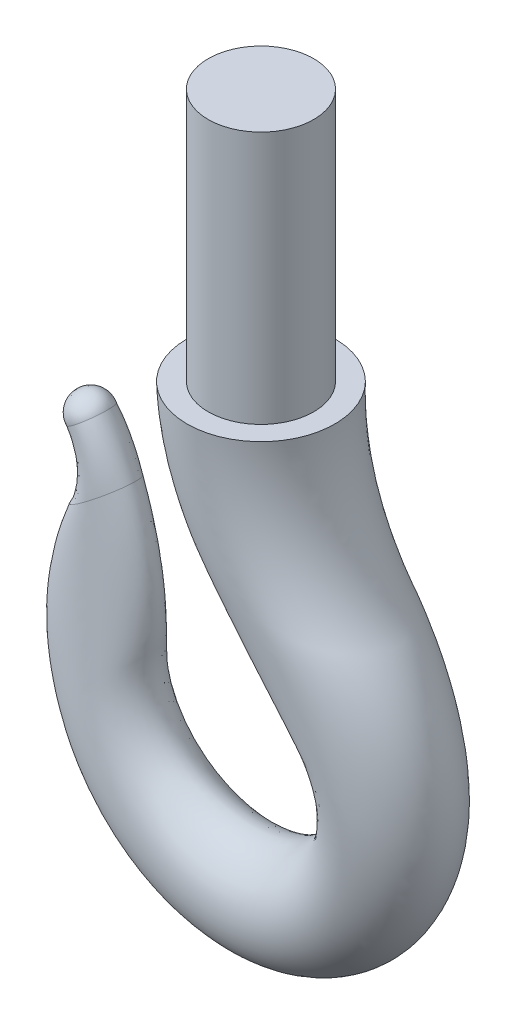
ISO-10303-21;
HEADER;
FILE_DESCRIPTION(('STEP AP214'),'2;1');
FILE_NAME('part.step','',(''),(''),'','','');
FILE_SCHEMA(('AUTOMOTIVE_DESIGN { 1 0 10303 214 1 1 1 1 }'));
ENDSEC;
DATA;
#1=APPLICATION_CONTEXT('core data for automotive mechanical design processes');
#2=APPLICATION_PROTOCOL_DEFINITION('international standard','automotive_design',2000,#1);
#3=PRODUCT_CONTEXT('',#1,'mechanical');
#4=PRODUCT('Part','Part','',(#3));
#5=PRODUCT_RELATED_PRODUCT_CATEGORY('part','',(#4));
#6=PRODUCT_DEFINITION_FORMATION('','',#4);
#7=PRODUCT_DEFINITION_CONTEXT('part definition',#1,'design');
#8=PRODUCT_DEFINITION('design','',#6,#7);
#9=PRODUCT_DEFINITION_SHAPE('','',#8);
#10=(LENGTH_UNIT() NAMED_UNIT(*) SI_UNIT(.MILLI.,.METRE.));
#11=(NAMED_UNIT(*) PLANE_ANGLE_UNIT() SI_UNIT($,.RADIAN.));
#12=(NAMED_UNIT(*) SI_UNIT($,.STERADIAN.) SOLID_ANGLE_UNIT());
#13=UNCERTAINTY_MEASURE_WITH_UNIT(LENGTH_MEASURE(1.E-05),#10,'distance_accuracy_value','');
#14=(GEOMETRIC_REPRESENTATION_CONTEXT(3) GLOBAL_UNCERTAINTY_ASSIGNED_CONTEXT((#13)) GLOBAL_UNIT_ASSIGNED_CONTEXT((#10,
#11,#12)) REPRESENTATION_CONTEXT('',''));
#15=CARTESIAN_POINT('',(0.,0.,0.));
#16=DIRECTION('',(0.,0.,1.));
#17=DIRECTION('',(1.,0.,0.));
#18=AXIS2_PLACEMENT_3D('',#15,#16,#17);
#19=CARTESIAN_POINT('',(0.,0.,0.));
#20=DIRECTION('',(0.,1.,0.));
#21=DIRECTION('',(0.,0.,1.));
#22=AXIS2_PLACEMENT_3D('',#19,#20,#21);
#23=PLANE('',#22);
#24=CARTESIAN_POINT('',(0.,0.,0.));
#25=DIRECTION('',(0.,1.,0.));
#26=DIRECTION('',(0.,0.,1.));
#27=AXIS2_PLACEMENT_3D('',#24,#25,#26);
#28=CIRCLE('',#27,14.);
#29=CARTESIAN_POINT('',(0.,0.,14.));
#30=VERTEX_POINT('',#29);
#31=EDGE_CURVE('E12',#30,#30,#28,.T.);
#32=ORIENTED_EDGE('',*,*,#31,.T.);
#33=EDGE_LOOP('',(#32));
#34=FACE_BOUND('',#33,.T.);
#35=CARTESIAN_POINT('',(0.,0.,0.));
#36=DIRECTION('',(0.,1.,0.));
#37=DIRECTION('',(0.,0.,1.));
#38=AXIS2_PLACEMENT_3D('',#35,#36,#37);
#39=CIRCLE('',#38,10.);
#40=CARTESIAN_POINT('',(0.,0.,10.));
#41=VERTEX_POINT('',#40);
#42=EDGE_CURVE('E162',#41,#41,#39,.T.);
#43=ORIENTED_EDGE('',*,*,#42,.F.);
#44=EDGE_LOOP('',(#43));
#45=FACE_BOUND('',#44,.T.);
#46=ADVANCED_FACE('F88',(#34,#45),#23,.T.);
#47=CARTESIAN_POINT('',(-32.2832191804509,-21.2166316273327,0.));
#48=DIRECTION('',(0.,0.,1.));
#49=DIRECTION('',(1.,0.,0.));
#50=AXIS2_PLACEMENT_3D('',#47,#48,#49);
#51=SPHERICAL_SURFACE('',#50,3.69517158666018);
#52=CARTESIAN_POINT('',(-29.1361884677433,-19.2800132477504,0.));
#53=CARTESIAN_POINT('',(-29.1361884677433,-19.2800132477504,0.482048186348917));
#54=CARTESIAN_POINT('',(-29.2905063515171,-19.3935336801986,1.44598126916191));
#55=CARTESIAN_POINT('',(-29.9503620771288,-19.8789414987417,2.6718688131776));
#56=CARTESIAN_POINT('',(-30.9377884672369,-20.6053192073685,3.49093880466145));
#57=CARTESIAN_POINT('',(-32.1025886580201,-21.4621779079921,3.77858879066938));
#58=CARTESIAN_POINT('',(-33.2673888488033,-22.3190366086154,3.49093880466144));
#59=CARTESIAN_POINT('',(-34.2548152389115,-23.0454143172425,2.67186881317762));
#60=CARTESIAN_POINT('',(-34.9146709645231,-23.5308221357855,1.4459812691619));
#61=CARTESIAN_POINT('',(-35.0689888482969,-23.6443425682336,0.482048186348917));
#62=CARTESIAN_POINT('',(-35.0689888482969,-23.6443425682336,-0.482048186348916));
#63=CARTESIAN_POINT('',(-34.9146709645232,-23.5308221357855,-1.4459812691619));
#64=CARTESIAN_POINT('',(-34.2548152389114,-23.0454143172424,-2.6718688131776));
#65=CARTESIAN_POINT('',(-33.2673888488033,-22.3190366086154,-3.49093880466145));
#66=CARTESIAN_POINT('',(-32.1025886580202,-21.4621779079921,-3.77858879066938));
#67=CARTESIAN_POINT('',(-30.9377884672368,-20.6053192073685,-3.49093880466145));
#68=CARTESIAN_POINT('',(-29.950362077129,-19.8789414987417,-2.6718688131776));
#69=CARTESIAN_POINT('',(-29.290506351517,-19.3935336801985,-1.44598126916191));
#70=CARTESIAN_POINT('',(-29.1361884677433,-19.2800132477504,-0.482048186348917));
#71=CARTESIAN_POINT('',(-29.1361884677433,-19.2800132477504,0.));
#72=B_SPLINE_CURVE_WITH_KNOTS('',3,(#52,#53,#54,#55,#56,#57,#58,#59,#60,#61,#62,#63,#64,#65,#66,
#67,#68,#69,#70,#71),.UNSPECIFIED.,.T.,.F.,(4,1,1,1,1,1,1,1,2,1,1,1,1,1,1,1,4),(0.,0.0625,0.125,
0.1875,0.25,0.3125,0.375,0.4375,0.5,0.5625,0.625,0.6875,0.75,0.8125,0.875,0.9375,1.),.UNSPECIFIED.);
#73=CARTESIAN_POINT('',(-29.1361884677433,-19.2800132477504,0.));
#74=VERTEX_POINT('',#73);
#75=EDGE_CURVE('E104',#74,#74,#72,.T.);
#76=ORIENTED_EDGE('',*,*,#75,.F.);
#77=EDGE_LOOP('',(#76));
#78=FACE_BOUND('',#77,.T.);
#79=ADVANCED_FACE('F90',(#78),#51,.T.);
#80=CARTESIAN_POINT('',(-23.831890082785,-28.35520758759,0.));
#81=CARTESIAN_POINT('',(-25.2662189984446,-25.1740776091497,0.));
#82=CARTESIAN_POINT('',(-27.0393677070277,-22.1303982882976,0.));
#83=CARTESIAN_POINT('',(-29.1361884677433,-19.2800132477504,0.));
#84=CARTESIAN_POINT('',(-23.831890082785,-28.35520758759,-0.568207212607572));
#85=CARTESIAN_POINT('',(-25.2662189984446,-25.1740776091497,-0.53948753718802));
#86=CARTESIAN_POINT('',(-27.0393677070277,-22.1303982882976,-0.510767861768469));
#87=CARTESIAN_POINT('',(-29.1361884677433,-19.2800132477504,-0.482048186348917));
#88=CARTESIAN_POINT('',(-24.1570306193986,-28.5851522240037,-1.70442646142253));
#89=CARTESIAN_POINT('',(-25.4597638242147,-25.3823461165194,-1.61827806400232));
#90=CARTESIAN_POINT('',(-27.1762420815947,-22.27325670226,-1.53212966658212));
#91=CARTESIAN_POINT('',(-29.290506351517,-19.3935336801985,-1.44598126916191));
#92=CARTESIAN_POINT('',(-25.4278526780244,-29.5033418131165,-3.14942800427261));
#93=CARTESIAN_POINT('',(-26.2469748388891,-26.2205198864843,-2.99024160724094));
#94=CARTESIAN_POINT('',(-27.7608117759701,-22.8674122867143,-2.83105521020927));
#95=CARTESIAN_POINT('',(-29.950362077129,-19.8789414987417,-2.6718688131776));
#96=CARTESIAN_POINT('',(-27.2474159919995,-30.8326279337398,-4.11489279949806));
#97=CARTESIAN_POINT('',(-27.3972213387829,-27.4387792159009,-3.90690813455252));
#98=CARTESIAN_POINT('',(-28.6350990748959,-23.7450415120166,-3.69892346960699));
#99=CARTESIAN_POINT('',(-30.9377884672368,-20.6053192073685,-3.49093880466145));
#100=CARTESIAN_POINT('',(-29.3499826293955,-32.3768206629841,-4.4539561288373));
#101=CARTESIAN_POINT('',(-28.7392702012599,-28.8566522359388,-4.22883368278133));
#102=CARTESIAN_POINT('',(-29.6661817202975,-24.7741910366678,-4.00371123672535));
#103=CARTESIAN_POINT('',(-32.1025886580202,-21.4621779079921,-3.77858879066938));
#104=CARTESIAN_POINT('',(-31.4525492667911,-33.9210133922282,-4.11489279949805));
#105=CARTESIAN_POINT('',(-30.0813190637365,-30.2745252559765,-3.90690813455252));
#106=CARTESIAN_POINT('',(-30.6972643656988,-25.8033405613189,-3.69892346960699));
#107=CARTESIAN_POINT('',(-33.2673888488033,-22.3190366086154,-3.49093880466145));
#108=CARTESIAN_POINT('',(-33.2721125807665,-35.2502995128516,-3.14942800427261));
#109=CARTESIAN_POINT('',(-31.2315655636307,-31.4927845853932,-2.99024160724094));
#110=CARTESIAN_POINT('',(-31.5715516646249,-26.6809697866212,-2.83105521020927));
#111=CARTESIAN_POINT('',(-34.2548152389114,-23.0454143172424,-2.6718688131776));
#112=CARTESIAN_POINT('',(-34.5429346393921,-36.1684891019644,-1.70442646142252));
#113=CARTESIAN_POINT('',(-32.0187765783049,-32.3309583553581,-1.61827806400231));
#114=CARTESIAN_POINT('',(-32.1561213590001,-27.2751253710756,-1.53212966658211));
#115=CARTESIAN_POINT('',(-34.9146709645232,-23.5308221357855,-1.4459812691619));
#116=CARTESIAN_POINT('',(-34.8680751760058,-36.3984337383781,-0.568207212607572));
#117=CARTESIAN_POINT('',(-32.212321404075,-32.5392268627278,-0.53948753718802));
#118=CARTESIAN_POINT('',(-32.2929957335672,-27.4179837850379,-0.510767861768468));
#119=CARTESIAN_POINT('',(-35.0689888482969,-23.6443425682336,-0.482048186348916));
#120=CARTESIAN_POINT('',(-34.8680751760058,-36.3984337383781,0.568207212607572));
#121=CARTESIAN_POINT('',(-32.212321404075,-32.5392268627278,0.53948753718802));
#122=CARTESIAN_POINT('',(-32.2929957335672,-27.4179837850379,0.510767861768468));
#123=CARTESIAN_POINT('',(-35.0689888482969,-23.6443425682336,0.482048186348917));
#124=CARTESIAN_POINT('',(-34.5429346393921,-36.1684891019643,1.70442646142252));
#125=CARTESIAN_POINT('',(-32.0187765783048,-32.330958355358,1.61827806400232));
#126=CARTESIAN_POINT('',(-32.156121359,-27.2751253710755,1.53212966658211));
#127=CARTESIAN_POINT('',(-34.9146709645231,-23.5308221357855,1.4459812691619));
#128=CARTESIAN_POINT('',(-33.2721125807666,-35.2502995128517,3.14942800427262));
#129=CARTESIAN_POINT('',(-31.2315655636307,-31.4927845853933,2.99024160724095));
#130=CARTESIAN_POINT('',(-31.571551664625,-26.6809697866213,2.83105521020929));
#131=CARTESIAN_POINT('',(-34.2548152389115,-23.0454143172425,2.67186881317762));
#132=CARTESIAN_POINT('',(-31.4525492667911,-33.9210133922281,4.11489279949805));
#133=CARTESIAN_POINT('',(-30.0813190637365,-30.2745252559765,3.90690813455252));
#134=CARTESIAN_POINT('',(-30.6972643656988,-25.8033405613189,3.69892346960698));
#135=CARTESIAN_POINT('',(-33.2673888488033,-22.3190366086154,3.49093880466144));
#136=CARTESIAN_POINT('',(-29.3499826293954,-32.3768206629841,4.4539561288373));
#137=CARTESIAN_POINT('',(-28.7392702012598,-28.8566522359388,4.22883368278133));
#138=CARTESIAN_POINT('',(-29.6661817202974,-24.7741910366679,4.00371123672536));
#139=CARTESIAN_POINT('',(-32.1025886580201,-21.4621779079921,3.77858879066938));
#140=CARTESIAN_POINT('',(-27.2474159919996,-30.8326279337398,4.11489279949805));
#141=CARTESIAN_POINT('',(-27.397221338783,-27.4387792159009,3.90690813455252));
#142=CARTESIAN_POINT('',(-28.635099074896,-23.7450415120165,3.69892346960698));
#143=CARTESIAN_POINT('',(-30.9377884672369,-20.6053192073685,3.49093880466145));
#144=CARTESIAN_POINT('',(-25.4278526780243,-29.5033418131165,3.14942800427261));
#145=CARTESIAN_POINT('',(-26.2469748388889,-26.2205198864843,2.99024160724094));
#146=CARTESIAN_POINT('',(-27.7608117759699,-22.8674122867143,2.83105521020927));
#147=CARTESIAN_POINT('',(-29.9503620771288,-19.8789414987417,2.6718688131776));
#148=CARTESIAN_POINT('',(-24.1570306193987,-28.5851522240037,1.70442646142252));
#149=CARTESIAN_POINT('',(-25.4597638242147,-25.3823461165194,1.61827806400232));
#150=CARTESIAN_POINT('',(-27.1762420815948,-22.27325670226,1.53212966658211));
#151=CARTESIAN_POINT('',(-29.2905063515171,-19.3935336801986,1.44598126916191));
#152=CARTESIAN_POINT('',(-23.831890082785,-28.35520758759,0.568207212607572));
#153=CARTESIAN_POINT('',(-25.2662189984446,-25.1740776091497,0.53948753718802));
#154=CARTESIAN_POINT('',(-27.0393677070277,-22.1303982882976,0.510767861768468));
#155=CARTESIAN_POINT('',(-29.1361884677433,-19.2800132477504,0.482048186348917));
#156=CARTESIAN_POINT('',(-23.831890082785,-28.35520758759,0.));
#157=CARTESIAN_POINT('',(-25.2662189984446,-25.1740776091497,0.));
#158=CARTESIAN_POINT('',(-27.0393677070277,-22.1303982882976,0.));
#159=CARTESIAN_POINT('',(-29.1361884677433,-19.2800132477504,0.));
#160=B_SPLINE_SURFACE_WITH_KNOTS('',3,3,((#80,#81,#82,#83),(#84,#85,#86,#87),(#88,#89,#90,#91),
(#92,#93,#94,#95),(#96,#97,#98,#99),(#100,#101,#102,#103),(#104,#105,#106,#107),(#108,#109,#110,
#111),(#112,#113,#114,#115),(#116,#117,#118,#119),(#120,#121,#122,#123),(#124,#125,#126,#127),
(#128,#129,#130,#131),(#132,#133,#134,#135),(#136,#137,#138,#139),(#140,#141,#142,#143),(#144,
#145,#146,#147),(#148,#149,#150,#151),(#152,#153,#154,#155),(#156,#157,#158,#159)),
.UNSPECIFIED.,.T.,.F.,.F.,(4,1,1,1,1,1,1,1,2,1,1,1,1,1,1,1,4),(4,4),(0.,0.0625,0.125,0.1875,
0.25,0.3125,0.375,0.4375,0.5,0.5625,0.625,0.6875,0.75,0.8125,0.875,0.9375,1.),
(0.936204372382546,1.),.UNSPECIFIED.);
#161=CARTESIAN_POINT('',(-23.831890082785,-28.35520758759,0.));
#162=CARTESIAN_POINT('',(-23.831890082785,-28.35520758759,-0.568207212607572));
#163=CARTESIAN_POINT('',(-24.1570306193986,-28.5851522240037,-1.70442646142253));
#164=CARTESIAN_POINT('',(-25.4278526780244,-29.5033418131165,-3.14942800427261));
#165=CARTESIAN_POINT('',(-27.2474159919995,-30.8326279337398,-4.11489279949806));
#166=CARTESIAN_POINT('',(-29.3499826293955,-32.3768206629841,-4.4539561288373));
#167=CARTESIAN_POINT('',(-31.4525492667911,-33.9210133922282,-4.11489279949805));
#168=CARTESIAN_POINT('',(-33.2721125807665,-35.2502995128516,-3.14942800427261));
#169=CARTESIAN_POINT('',(-34.5429346393921,-36.1684891019644,-1.70442646142252));
#170=CARTESIAN_POINT('',(-34.8680751760058,-36.3984337383781,-0.568207212607572));
#171=CARTESIAN_POINT('',(-34.8680751760058,-36.3984337383781,0.568207212607572));
#172=CARTESIAN_POINT('',(-34.5429346393921,-36.1684891019643,1.70442646142252));
#173=CARTESIAN_POINT('',(-33.2721125807666,-35.2502995128517,3.14942800427262));
#174=CARTESIAN_POINT('',(-31.4525492667911,-33.9210133922281,4.11489279949805));
#175=CARTESIAN_POINT('',(-29.3499826293954,-32.3768206629841,4.4539561288373));
#176=CARTESIAN_POINT('',(-27.2474159919996,-30.8326279337398,4.11489279949805));
#177=CARTESIAN_POINT('',(-25.4278526780243,-29.5033418131165,3.14942800427261));
#178=CARTESIAN_POINT('',(-24.1570306193987,-28.5851522240037,1.70442646142252));
#179=CARTESIAN_POINT('',(-23.831890082785,-28.35520758759,0.568207212607572));
#180=CARTESIAN_POINT('',(-23.831890082785,-28.35520758759,0.));
#181=B_SPLINE_CURVE_WITH_KNOTS('',3,(#161,#162,#163,#164,#165,#166,#167,#168,#169,#170,#171,
#172,#173,#174,#175,#176,#177,#178,#179,#180),.UNSPECIFIED.,.T.,.F.,(4,1,1,1,1,1,1,1,2,1,1,1,1,
1,1,1,4),(0.,0.0625,0.125,0.1875,0.25,0.3125,0.375,0.4375,0.5,0.5625,0.625,0.6875,0.75,0.8125,
0.875,0.9375,1.),.UNSPECIFIED.);
#182=CARTESIAN_POINT('',(-23.831890082785,-28.35520758759,0.));
#183=VERTEX_POINT('',#182);
#184=EDGE_CURVE('E98',#183,#183,#181,.T.);
#185=ORIENTED_EDGE('',*,*,#75,.T.);
#186=EDGE_LOOP('',(#185));
#187=FACE_BOUND('',#186,.T.);
#188=ORIENTED_EDGE('',*,*,#184,.T.);
#189=EDGE_LOOP('',(#188));
#190=FACE_BOUND('',#189,.T.);
#191=ADVANCED_FACE('F119',(#187,#190),#160,.T.);
#192=CARTESIAN_POINT('',(-14.,0.,0.));
#193=CARTESIAN_POINT('',(-14.,-8.53332128012855,0.));
#194=CARTESIAN_POINT('',(-11.7780503612515,-16.7713927721381,0.));
#195=CARTESIAN_POINT('',(-5.65253140781888,-27.6809519305476,0.));
#196=CARTESIAN_POINT('',(-0.994173525504693,-33.9342099778864,0.));
#197=CARTESIAN_POINT('',(5.08639168355526,-38.9764876543655,0.));
#198=CARTESIAN_POINT('',(10.5611562812239,-42.5725426220171,0.));
#199=CARTESIAN_POINT('',(14.4558398320962,-46.8521447813866,0.));
#200=CARTESIAN_POINT('',(16.85207291022,-54.9583359769641,0.));
#201=CARTESIAN_POINT('',(15.2896115616355,-63.6704053356924,0.));
#202=CARTESIAN_POINT('',(9.80382084597629,-70.6222560852749,0.));
#203=CARTESIAN_POINT('',(2.19798645174925,-74.2268700916352,0.));
#204=CARTESIAN_POINT('',(-6.65627149584939,-74.0711626163135,0.));
#205=CARTESIAN_POINT('',(-13.5177013921636,-70.2494268266658,0.));
#206=CARTESIAN_POINT('',(-18.7775123795209,-63.7150106567831,0.));
#207=CARTESIAN_POINT('',(-20.0960556369127,-58.0427996097158,0.));
#208=CARTESIAN_POINT('',(-19.1860846746656,-49.3650357559735,0.));
#209=CARTESIAN_POINT('',(-19.3761782250312,-44.6013802107606,0.));
#210=CARTESIAN_POINT('',(-20.9446678846703,-35.9701600571284,0.));
#211=CARTESIAN_POINT('',(-22.1573838306615,-32.0690154733261,0.));
#212=CARTESIAN_POINT('',(-23.831890082785,-28.35520758759,0.));
#213=CARTESIAN_POINT('',(-14.,0.,-1.83259569997008));
#214=CARTESIAN_POINT('',(-14.,-8.53332128012855,-1.76333737097699));
#215=CARTESIAN_POINT('',(-11.7780503612515,-16.7713927721381,-1.6940790419839));
#216=CARTESIAN_POINT('',(-5.65253140781888,-27.6809519305476,-1.58941229789164));
#217=CARTESIAN_POINT('',(-0.994173525504695,-33.9342099778864,-1.52475106398786));
#218=CARTESIAN_POINT('',(5.08639168355526,-38.9764876543655,-1.46008983008408));
#219=CARTESIAN_POINT('',(10.5611562812239,-42.5725426220171,-1.40692723924169));
#220=CARTESIAN_POINT('',(14.4558398320962,-46.8521447813866,-1.35910769516615));
#221=CARTESIAN_POINT('',(16.85207291022,-54.9583359769641,-1.28737837905283));
#222=CARTESIAN_POINT('',(15.2896115616355,-63.6704053356924,-1.21564906293952));
#223=CARTESIAN_POINT('',(9.80382084597629,-70.6222560852749,-1.1439197468262));
#224=CARTESIAN_POINT('',(2.19798645174925,-74.2268700916352,-1.07219043071289));
#225=CARTESIAN_POINT('',(-6.65627149584939,-74.0711626163135,-1.00046111459957));
#226=CARTESIAN_POINT('',(-13.5177013921636,-70.2494268266658,-0.936812302998075));
#227=CARTESIAN_POINT('',(-18.7775123795209,-63.7150106567831,-0.86508298688476));
#228=CARTESIAN_POINT('',(-20.0960556369127,-58.0427996097158,-0.817263442809217));
#229=CARTESIAN_POINT('',(-19.1860846746656,-49.3650357559735,-0.746446612610892));
#230=CARTESIAN_POINT('',(-19.3761782250312,-44.6013802107606,-0.707620058962155));
#231=CARTESIAN_POINT('',(-20.9446678846703,-35.9701600571284,-0.635264741078136));
#232=CARTESIAN_POINT('',(-22.1573838306615,-32.0690154733261,-0.601735976842854));
#233=CARTESIAN_POINT('',(-23.831890082785,-28.35520758759,-0.568207212607572));
#234=CARTESIAN_POINT('',(-13.2717024786423,0.,-5.49712398712942));
#235=CARTESIAN_POINT('',(-13.2625853874916,-8.61852348342449,-5.28937463190187));
#236=CARTESIAN_POINT('',(-10.9681458901478,-16.93814023715,-5.08162527667432));
#237=CARTESIAN_POINT('',(-4.65876079769873,-27.8973918649138,-4.7676637804173));
#238=CARTESIAN_POINT('',(0.0207956849641935,-34.237497556937,-4.57370400912296));
#239=CARTESIAN_POINT('',(5.95746618901765,-39.4339998230952,-4.37974423782862));
#240=CARTESIAN_POINT('',(11.2516772451962,-43.1741830253533,-4.22027614019615));
#241=CARTESIAN_POINT('',(14.9806267338913,-47.5519394930949,-4.07683520546091));
#242=CARTESIAN_POINT('',(17.1348065349013,-55.718692319346,-3.86167380335807));
#243=CARTESIAN_POINT('',(15.3672742751397,-64.4033346161417,-3.64651240125522));
#244=CARTESIAN_POINT('',(9.74836570473691,-71.2917465683089,-3.43135099915237));
#245=CARTESIAN_POINT('',(2.04314412185369,-74.8376461956658,-3.21618959704953));
#246=CARTESIAN_POINT('',(-6.88242189965538,-74.6373248901618,-3.00102819494668));
#247=CARTESIAN_POINT('',(-13.8103971327361,-70.7962021635208,-2.81010531587274));
#248=CARTESIAN_POINT('',(-19.1702702547262,-64.2383848895915,-2.5949439137699));
#249=CARTESIAN_POINT('',(-20.5692757083373,-58.5470808138231,-2.45150297903467));
#250=CARTESIAN_POINT('',(-19.8067039643849,-49.8217426225497,-2.23907869697571));
#251=CARTESIAN_POINT('',(-20.0156661745639,-45.0134501170184,-2.12261340531328));
#252=CARTESIAN_POINT('',(-21.4873869712823,-36.2838893632754,-1.90557422957475));
#253=CARTESIAN_POINT('',(-22.6117406361667,-32.3382554569652,-1.80500034549864));
#254=CARTESIAN_POINT('',(-24.1570306193986,-28.5851522240037,-1.70442646142253));
#255=CARTESIAN_POINT('',(-10.1574770005794,0.,-10.1576356114706));
#256=CARTESIAN_POINT('',(-10.1379795336645,-8.94109357913968,-9.77375300500706));
#257=CARTESIAN_POINT('',(-7.59551178263843,-17.5695668976555,-9.38987039854352));
#258=CARTESIAN_POINT('',(-0.632609623461568,-28.7197924853299,-8.80972728628053));
#259=CARTESIAN_POINT('',(4.10421322325406,-35.3884354458362,-8.45132529522747));
#260=CARTESIAN_POINT('',(9.47905019627809,-41.1661385242083,-8.09292330417441));
#261=CARTESIAN_POINT('',(14.0779099366619,-45.4491528649928,-7.79825558354594));
#262=CARTESIAN_POINT('',(17.1689179192233,-50.1971020377534,-7.5332031127962));
#263=CARTESIAN_POINT('',(18.390739771602,-58.5941320519663,-7.13562440667159));
#264=CARTESIAN_POINT('',(15.8295334354722,-67.1790939394505,-6.73804570054698));
#265=CARTESIAN_POINT('',(9.68677475032674,-73.832781474246,-6.34046699442236));
#266=CARTESIAN_POINT('',(1.5841930505286,-77.1616732532755,-5.94288828829775));
#267=CARTESIAN_POINT('',(-7.63343640759883,-76.7972211575235,-5.54530958217314));
#268=CARTESIAN_POINT('',(-14.8328370036058,-72.8862112600158,-5.19251920950436));
#269=CARTESIAN_POINT('',(-20.5926012899233,-66.2438109188474,-4.79494050337975));
#270=CARTESIAN_POINT('',(-22.309778752326,-60.4830220340736,-4.52988803263001));
#271=CARTESIAN_POINT('',(-22.1242985540449,-51.5824108100111,-4.1373670210311));
#272=CARTESIAN_POINT('',(-22.4173655197028,-46.6084461818492,-3.92216057826289));
#273=CARTESIAN_POINT('',(-23.551076438566,-37.5133069254651,-3.521112091754));
#274=CARTESIAN_POINT('',(-24.3555976262181,-33.4023203289617,-3.3352700480133));
#275=CARTESIAN_POINT('',(-25.4278526780244,-29.5033418131165,-3.14942800427261));
#276=CARTESIAN_POINT('',(-5.49727852198366,0.,-13.2714522683442));
#277=CARTESIAN_POINT('',(-5.48191050143654,-9.39509204199657,-12.7698912256136));
#278=CARTESIAN_POINT('',(-2.61086516769322,-18.4583648800745,-12.2683301828829));
#279=CARTESIAN_POINT('',(5.23875795361902,-29.8795815118784,-11.5103453734116));
#280=CARTESIAN_POINT('',(10.0383304457967,-37.0104176527416,-11.0420759771883));
#281=CARTESIAN_POINT('',(14.6091772111678,-43.6040428726935,-10.573806580965));
#282=CARTESIAN_POINT('',(18.2202202070128,-48.6488632962926,-10.1888090668056));
#283=CARTESIAN_POINT('',(20.4052248868668,-53.9167395676722,-9.84250529745211));
#284=CARTESIAN_POINT('',(20.302417819981,-62.6386436124201,-9.32304964342184));
#285=CARTESIAN_POINT('',(16.6107399857551,-71.0865388942568,-8.80359398939158));
#286=CARTESIAN_POINT('',(9.71526334878947,-77.4140982121203,-8.28413833536131));
#287=CARTESIAN_POINT('',(1.0370496941299,-80.4416649708801,-7.76468268133104));
#288=CARTESIAN_POINT('',(-8.60879636644378,-79.8499157361693,-7.24522702730077));
#289=CARTESIAN_POINT('',(-16.205342932955,-75.8432697157811,-6.78428947972295));
#290=CARTESIAN_POINT('',(-22.5442826405115,-69.0849390478665,-6.26483382569269));
#291=CARTESIAN_POINT('',(-24.7197861093429,-63.2285287420777,-5.91853005633917));
#292=CARTESIAN_POINT('',(-25.3613159926929,-54.0849896149088,-5.40568252285777));
#293=CARTESIAN_POINT('',(-25.7825916078796,-48.8804296510105,-5.12450498050557));
#294=CARTESIAN_POINT('',(-26.4625851679566,-39.2759881540489,-4.60051589193494));
#295=CARTESIAN_POINT('',(-26.8283753658362,-34.9346698184487,-4.3577043457165));
#296=CARTESIAN_POINT('',(-27.2474159919995,-30.8326279337398,-4.11489279949806));
#297=CARTESIAN_POINT('',(0.,0.,-14.3650092616412));
#298=CARTESIAN_POINT('',(0.,-9.91531730238395,-13.8221199634544));
#299=CARTESIAN_POINT('',(3.23591391786484,-19.4768737513694,-13.2792306652675));
#300=CARTESIAN_POINT('',(12.0828396327065,-31.2098646579576,-12.4587884734062));
#301=CARTESIAN_POINT('',(16.9441841678046,-38.8702005237785,-11.9519340285434));
#302=CARTESIAN_POINT('',(20.5862431439647,-46.3975871386573,-11.4450795836806));
#303=CARTESIAN_POINT('',(23.0601788269884,-52.3140945989318,-11.0283585617932));
#304=CARTESIAN_POINT('',(24.2023987781266,-58.177119101007,-10.6535196203948));
#305=CARTESIAN_POINT('',(22.574701515078,-67.2717265004918,-10.0912612082974));
#306=CARTESIAN_POINT('',(17.5800276803102,-75.5643929814278,-9.52900279619994));
#307=CARTESIAN_POINT('',(9.81327338140354,-81.5206530854945,-8.96674438410248));
#308=CARTESIAN_POINT('',(0.466166061327336,-84.2052671409284,-8.40448597200502));
#309=CARTESIAN_POINT('',(-9.68009897618848,-83.3551684958186,-7.84222755990757));
#310=CARTESIAN_POINT('',(-17.7403128268191,-79.2404829717861,-7.34330910254469));
#311=CARTESIAN_POINT('',(-24.7521958756523,-72.3510792502869,-6.78105069044724));
#312=CARTESIAN_POINT('',(-27.4588528774521,-66.3863331527548,-6.40621174904893));
#313=CARTESIAN_POINT('',(-29.0564254168063,-56.9665628364919,-5.85110596169995));
#314=CARTESIAN_POINT('',(-29.6301948893233,-51.4992333041654,-5.54675959978471));
#315=CARTESIAN_POINT('',(-29.8027791486656,-41.3141632339113,-4.97959420152541));
#316=CARTESIAN_POINT('',(-29.6723176382433,-36.7102717971544,-4.71677516518136));
#317=CARTESIAN_POINT('',(-29.3499826293955,-32.3768206629841,-4.4539561288373));
#318=CARTESIAN_POINT('',(5.49727852198367,0.,-13.2714522683442));
#319=CARTESIAN_POINT('',(5.48191050143655,-10.4355425627713,-12.7698912256136));
#320=CARTESIAN_POINT('',(9.0826930034229,-20.4953826226643,-12.2683301828829));
#321=CARTESIAN_POINT('',(18.926921311794,-32.5401478040368,-11.5103453734116));
#322=CARTESIAN_POINT('',(23.8500378898125,-40.7299833948155,-11.0420759771883));
#323=CARTESIAN_POINT('',(26.5633090767616,-49.1911314046211,-10.573806580965));
#324=CARTESIAN_POINT('',(27.900137446964,-55.979325901571,-10.1888090668056));
#325=CARTESIAN_POINT('',(27.9995726693865,-62.4374986343418,-9.84250529745208));
#326=CARTESIAN_POINT('',(24.8469852101752,-71.9048093885633,-9.32304964342182));
#327=CARTESIAN_POINT('',(18.5493153748654,-80.0422470685989,-8.80359398939155));
#328=CARTESIAN_POINT('',(9.91128341401774,-85.6272079588686,-8.28413833536129));
#329=CARTESIAN_POINT('',(-0.104717571475066,-87.9688693109766,-7.76468268133102));
#330=CARTESIAN_POINT('',(-10.751401585933,-86.8604212554678,-7.24522702730076));
#331=CARTESIAN_POINT('',(-19.275282720683,-82.6376962277911,-6.78428947972294));
#332=CARTESIAN_POINT('',(-26.9601091107928,-75.6172194527071,-6.26483382569267));
#333=CARTESIAN_POINT('',(-30.1979196455611,-69.5441375634317,-5.91853005633916));
#334=CARTESIAN_POINT('',(-32.7515348409195,-59.848136058075,-5.40568252285776));
#335=CARTESIAN_POINT('',(-33.4777981707667,-54.1180369573201,-5.12450498050557));
#336=CARTESIAN_POINT('',(-33.1429731293744,-43.3523383137734,-4.60051589193493));
#337=CARTESIAN_POINT('',(-32.5162599106502,-38.4858737758599,-4.35770434571649));
#338=CARTESIAN_POINT('',(-31.4525492667911,-33.9210133922282,-4.11489279949805));
#339=CARTESIAN_POINT('',(10.1574770005795,0.,-10.1576356114706));
#340=CARTESIAN_POINT('',(10.1379795336645,-10.8895410256282,-9.77375300500708));
#341=CARTESIAN_POINT('',(14.0673396183681,-21.3841806050833,-9.38987039854354));
#342=CARTESIAN_POINT('',(24.7982888888745,-33.6999368305854,-8.80972728628055));
#343=CARTESIAN_POINT('',(29.7841551123551,-42.3519656017208,-8.45132529522749));
#344=CARTESIAN_POINT('',(31.6934360916513,-51.6290357531063,-8.09292330417443));
#345=CARTESIAN_POINT('',(32.0424477173149,-59.1790363328708,-7.79825558354596));
#346=CARTESIAN_POINT('',(31.2358796370298,-66.1571361642606,-7.53320311279622));
#347=CARTESIAN_POINT('',(26.7586632585541,-75.9493209490172,-7.1356244066716));
#348=CARTESIAN_POINT('',(19.3305219251482,-83.9496920234051,-6.73804570054699));
#349=CARTESIAN_POINT('',(9.93977201248032,-89.2085246967429,-6.34046699442238));
#350=CARTESIAN_POINT('',(-0.651860927873931,-91.2488610285812,-5.94288828829776));
#351=CARTESIAN_POINT('',(-11.7267615447781,-89.9131158341137,-5.54530958217315));
#352=CARTESIAN_POINT('',(-20.6477886500324,-85.5947546835564,-5.19251920950437));
#353=CARTESIAN_POINT('',(-28.9117904613812,-78.4583475817263,-4.79494050337976));
#354=CARTESIAN_POINT('',(-32.6079270025783,-72.2896442714358,-4.52988803263002));
#355=CARTESIAN_POINT('',(-35.9885522795678,-62.3507148629727,-4.1373670210311));
#356=CARTESIAN_POINT('',(-36.8430242589438,-56.3900204264814,-3.9221605782629));
#357=CARTESIAN_POINT('',(-36.0544818587653,-45.1150195423574,-3.521112091754));
#358=CARTESIAN_POINT('',(-34.9890376502686,-40.018223265347,-3.3352700480133));
#359=CARTESIAN_POINT('',(-33.2721125807665,-35.2502995128516,-3.14942800427261));
#360=CARTESIAN_POINT('',(13.2717024786423,0.,-5.49712398712938));
#361=CARTESIAN_POINT('',(13.2625853874916,-11.2121111213434,-5.28937463190184));
#362=CARTESIAN_POINT('',(17.4399737258774,-22.0156072655888,-5.08162527667429));
#363=CARTESIAN_POINT('',(28.8244400631117,-34.5223374510014,-4.76766378041727));
#364=CARTESIAN_POINT('',(33.867572650645,-43.50290349062,-4.57370400912294));
#365=CARTESIAN_POINT('',(35.2150200989117,-53.3611744542194,-4.3797442378286));
#366=CARTESIAN_POINT('',(34.8686804087806,-61.4540061725103,-4.22027614019613));
#367=CARTESIAN_POINT('',(33.4241708223619,-68.8022987089191,-4.07683520546089));
#368=CARTESIAN_POINT('',(28.0145964952549,-78.8247606816375,-3.86167380335805));
#369=CARTESIAN_POINT('',(19.7927810854807,-86.7254513467139,-3.6465124012552));
#370=CARTESIAN_POINT('',(9.87818105807025,-91.74955960268,-3.43135099915236));
#371=CARTESIAN_POINT('',(-1.11081199919891,-93.5728880861909,-3.21618959704951));
#372=CARTESIAN_POINT('',(-12.4777760527215,-92.0730121014754,-3.00102819494666));
#373=CARTESIAN_POINT('',(-21.6702285209019,-87.6847637800514,-2.81010531587273));
#374=CARTESIAN_POINT('',(-30.3341214965782,-80.4637736109821,-2.59494391376989));
#375=CARTESIAN_POINT('',(-34.3484300465669,-74.2255854916864,-2.45150297903465));
#376=CARTESIAN_POINT('',(-38.3061468692276,-64.1113830504341,-2.2390786969757));
#377=CARTESIAN_POINT('',(-39.2447236040825,-57.9850164913122,-2.12261340531327));
#378=CARTESIAN_POINT('',(-38.1181713260487,-46.3444371045471,-1.90557422957474));
#379=CARTESIAN_POINT('',(-36.7328946403197,-41.0822881373435,-1.80500034549863));
#380=CARTESIAN_POINT('',(-34.5429346393921,-36.1684891019644,-1.70442646142252));
#381=CARTESIAN_POINT('',(14.,0.,-1.83259569997008));
#382=CARTESIAN_POINT('',(14.,-11.2973133246393,-1.76333737097699));
#383=CARTESIAN_POINT('',(18.2498781969812,-22.1823547306007,-1.6940790419839));
#384=CARTESIAN_POINT('',(29.8182106732318,-34.7387773853677,-1.58941229789164));
#385=CARTESIAN_POINT('',(34.8825418611138,-43.8061910696706,-1.52475106398786));
#386=CARTESIAN_POINT('',(36.0860946043741,-53.8186866229491,-1.46008983008408));
#387=CARTESIAN_POINT('',(35.5592013727529,-62.0556465758465,-1.40692723924169));
#388=CARTESIAN_POINT('',(33.948957724157,-69.5020934206273,-1.35910769516615));
#389=CARTESIAN_POINT('',(28.2973301199361,-79.5851170240194,-1.28737837905283));
#390=CARTESIAN_POINT('',(19.8704437989849,-87.4583806271632,-1.21564906293952));
#391=CARTESIAN_POINT('',(9.82272591683083,-92.419050085714,-1.1439197468262));
#392=CARTESIAN_POINT('',(-1.26565432909451,-94.1836641902214,-1.07219043071289));
#393=CARTESIAN_POINT('',(-12.7039264565275,-92.6391743753236,-1.00046111459957));
#394=CARTESIAN_POINT('',(-21.9629242614745,-88.2315391169064,-0.936812302998075));
#395=CARTESIAN_POINT('',(-30.7268793717836,-80.9871478437905,-0.86508298688476));
#396=CARTESIAN_POINT('',(-34.8216501179915,-74.7298666957937,-0.817263442809217));
#397=CARTESIAN_POINT('',(-38.926766158947,-64.5680899170102,-0.746446612610892));
#398=CARTESIAN_POINT('',(-39.8842115536153,-58.3970863975701,-0.707620058962155));
#399=CARTESIAN_POINT('',(-38.6608904126608,-46.6581664106941,-0.635264741078136));
#400=CARTESIAN_POINT('',(-37.1872514458251,-41.3515281209826,-0.601735976842854));
#401=CARTESIAN_POINT('',(-34.8680751760058,-36.3984337383781,-0.568207212607572));
#402=CARTESIAN_POINT('',(14.,0.,1.83259569997008));
#403=CARTESIAN_POINT('',(14.,-11.2973133246393,1.76333737097699));
#404=CARTESIAN_POINT('',(18.2498781969812,-22.1823547306007,1.6940790419839));
#405=CARTESIAN_POINT('',(29.8182106732318,-34.7387773853677,1.58941229789164));
#406=CARTESIAN_POINT('',(34.8825418611138,-43.8061910696706,1.52475106398786));
#407=CARTESIAN_POINT('',(36.0860946043741,-53.8186866229491,1.46008983008408));
#408=CARTESIAN_POINT('',(35.5592013727529,-62.0556465758465,1.40692723924169));
#409=CARTESIAN_POINT('',(33.948957724157,-69.5020934206273,1.35910769516615));
#410=CARTESIAN_POINT('',(28.2973301199361,-79.5851170240194,1.28737837905283));
#411=CARTESIAN_POINT('',(19.8704437989849,-87.4583806271632,1.21564906293952));
#412=CARTESIAN_POINT('',(9.82272591683083,-92.419050085714,1.1439197468262));
#413=CARTESIAN_POINT('',(-1.26565432909451,-94.1836641902214,1.07219043071289));
#414=CARTESIAN_POINT('',(-12.7039264565275,-92.6391743753236,1.00046111459957));
#415=CARTESIAN_POINT('',(-21.9629242614745,-88.2315391169064,0.936812302998074));
#416=CARTESIAN_POINT('',(-30.7268793717836,-80.9871478437905,0.86508298688476));
#417=CARTESIAN_POINT('',(-34.8216501179915,-74.7298666957937,0.817263442809217));
#418=CARTESIAN_POINT('',(-38.926766158947,-64.5680899170102,0.746446612610892));
#419=CARTESIAN_POINT('',(-39.8842115536153,-58.3970863975701,0.707620058962155));
#420=CARTESIAN_POINT('',(-38.6608904126608,-46.6581664106941,0.635264741078136));
#421=CARTESIAN_POINT('',(-37.1872514458251,-41.3515281209826,0.601735976842854));
#422=CARTESIAN_POINT('',(-34.8680751760058,-36.3984337383781,0.568207212607572));
#423=CARTESIAN_POINT('',(13.2717024786423,0.,5.4971239871294));
#424=CARTESIAN_POINT('',(13.2625853874916,-11.2121111213434,5.28937463190185));
#425=CARTESIAN_POINT('',(17.4399737258774,-22.0156072655888,5.0816252766743));
#426=CARTESIAN_POINT('',(28.8244400631117,-34.5223374510014,4.76766378041728));
#427=CARTESIAN_POINT('',(33.8675726506449,-43.50290349062,4.57370400912294));
#428=CARTESIAN_POINT('',(35.2150200989117,-53.3611744542193,4.37974423782861));
#429=CARTESIAN_POINT('',(34.8686804087806,-61.4540061725103,4.22027614019613));
#430=CARTESIAN_POINT('',(33.4241708223619,-68.8022987089191,4.0768352054609));
#431=CARTESIAN_POINT('',(28.0145964952549,-78.8247606816375,3.86167380335805));
#432=CARTESIAN_POINT('',(19.7927810854807,-86.7254513467139,3.64651240125521));
#433=CARTESIAN_POINT('',(9.87818105807025,-91.74955960268,3.43135099915236));
#434=CARTESIAN_POINT('',(-1.1108119991989,-93.5728880861909,3.21618959704952));
#435=CARTESIAN_POINT('',(-12.4777760527214,-92.0730121014753,3.00102819494667));
#436=CARTESIAN_POINT('',(-21.6702285209019,-87.6847637800514,2.81010531587274));
#437=CARTESIAN_POINT('',(-30.3341214965782,-80.4637736109821,2.59494391376989));
#438=CARTESIAN_POINT('',(-34.3484300465668,-74.2255854916863,2.45150297903466));
#439=CARTESIAN_POINT('',(-38.3061468692276,-64.111383050434,2.2390786969757));
#440=CARTESIAN_POINT('',(-39.2447236040825,-57.9850164913122,2.12261340531327));
#441=CARTESIAN_POINT('',(-38.1181713260487,-46.344437104547,1.90557422957474));
#442=CARTESIAN_POINT('',(-36.7328946403197,-41.0822881373434,1.80500034549863));
#443=CARTESIAN_POINT('',(-34.5429346393921,-36.1684891019643,1.70442646142252));
#444=CARTESIAN_POINT('',(10.1574770005795,0.,10.1576356114706));
#445=CARTESIAN_POINT('',(10.1379795336645,-10.8895410256282,9.77375300500709));
#446=CARTESIAN_POINT('',(14.0673396183681,-21.3841806050833,9.38987039854355));
#447=CARTESIAN_POINT('',(24.7982888888745,-33.6999368305854,8.80972728628056));
#448=CARTESIAN_POINT('',(29.784155112355,-42.3519656017209,8.4513252952275));
#449=CARTESIAN_POINT('',(31.6934360916513,-51.6290357531063,8.09292330417444));
#450=CARTESIAN_POINT('',(32.0424477173149,-59.1790363328708,7.79825558354597));
#451=CARTESIAN_POINT('',(31.2358796370298,-66.1571361642606,7.53320311279623));
#452=CARTESIAN_POINT('',(26.7586632585541,-75.9493209490172,7.13562440667161));
#453=CARTESIAN_POINT('',(19.3305219251482,-83.9496920234051,6.738045700547));
#454=CARTESIAN_POINT('',(9.93977201248029,-89.208524696743,6.34046699442239));
#455=CARTESIAN_POINT('',(-0.651860927873959,-91.2488610285812,5.94288828829777));
#456=CARTESIAN_POINT('',(-11.7267615447782,-89.9131158341137,5.54530958217316));
#457=CARTESIAN_POINT('',(-20.6477886500324,-85.5947546835565,5.19251920950438));
#458=CARTESIAN_POINT('',(-28.9117904613813,-78.4583475817263,4.79494050337977));
#459=CARTESIAN_POINT('',(-32.6079270025783,-72.2896442714359,4.52988803263003));
#460=CARTESIAN_POINT('',(-35.9885522795678,-62.3507148629727,4.13736702103112));
#461=CARTESIAN_POINT('',(-36.8430242589439,-56.3900204264815,3.92216057826291));
#462=CARTESIAN_POINT('',(-36.0544818587653,-45.1150195423575,3.52111209175401));
#463=CARTESIAN_POINT('',(-34.9890376502686,-40.018223265347,3.33527004801332));
#464=CARTESIAN_POINT('',(-33.2721125807666,-35.2502995128517,3.14942800427262));
#465=CARTESIAN_POINT('',(5.49727852198365,0.,13.2714522683442));
#466=CARTESIAN_POINT('',(5.48191050143654,-10.4355425627713,12.7698912256136));
#467=CARTESIAN_POINT('',(9.08269300342288,-20.4953826226643,12.2683301828829));
#468=CARTESIAN_POINT('',(18.9269213117939,-32.5401478040368,11.5103453734116));
#469=CARTESIAN_POINT('',(23.8500378898124,-40.7299833948155,11.0420759771883));
#470=CARTESIAN_POINT('',(26.5633090767616,-49.1911314046211,10.573806580965));
#471=CARTESIAN_POINT('',(27.900137446964,-55.979325901571,10.1888090668056));
#472=CARTESIAN_POINT('',(27.9995726693865,-62.4374986343418,9.84250529745209));
#473=CARTESIAN_POINT('',(24.8469852101752,-71.9048093885633,9.32304964342182));
#474=CARTESIAN_POINT('',(18.5493153748653,-80.0422470685988,8.80359398939156));
#475=CARTESIAN_POINT('',(9.91128341401772,-85.6272079588686,8.28413833536129));
#476=CARTESIAN_POINT('',(-0.10471757147508,-87.9688693109765,7.76468268133103));
#477=CARTESIAN_POINT('',(-10.751401585933,-86.8604212554677,7.24522702730076));
#478=CARTESIAN_POINT('',(-19.275282720683,-82.637696227791,6.78428947972294));
#479=CARTESIAN_POINT('',(-26.9601091107928,-75.617219452707,6.26483382569267));
#480=CARTESIAN_POINT('',(-30.1979196455612,-69.5441375634317,5.91853005633916));
#481=CARTESIAN_POINT('',(-32.7515348409195,-59.8481360580749,5.40568252285776));
#482=CARTESIAN_POINT('',(-33.4777981707667,-54.1180369573201,5.12450498050556));
#483=CARTESIAN_POINT('',(-33.1429731293744,-43.3523383137734,4.60051589193493));
#484=CARTESIAN_POINT('',(-32.5162599106502,-38.4858737758599,4.35770434571649));
#485=CARTESIAN_POINT('',(-31.4525492667911,-33.9210133922281,4.11489279949805));
#486=CARTESIAN_POINT('',(0.,0.,14.3650092616412));
#487=CARTESIAN_POINT('',(0.,-9.91531730238395,13.8221199634544));
#488=CARTESIAN_POINT('',(3.23591391786481,-19.4768737513694,13.2792306652675));
#489=CARTESIAN_POINT('',(12.0828396327064,-31.2098646579576,12.4587884734062));
#490=CARTESIAN_POINT('',(16.9441841678046,-38.8702005237786,11.9519340285434));
#491=CARTESIAN_POINT('',(20.5862431439647,-46.3975871386573,11.4450795836806));
#492=CARTESIAN_POINT('',(23.0601788269884,-52.3140945989318,11.0283585617932));
#493=CARTESIAN_POINT('',(24.2023987781266,-58.1771191010071,10.6535196203949));
#494=CARTESIAN_POINT('',(22.5747015150781,-67.2717265004918,10.0912612082974));
#495=CARTESIAN_POINT('',(17.5800276803102,-75.5643929814278,9.52900279619994));
#496=CARTESIAN_POINT('',(9.81327338140355,-81.5206530854945,8.96674438410249));
#497=CARTESIAN_POINT('',(0.46616606132736,-84.2052671409284,8.40448597200503));
#498=CARTESIAN_POINT('',(-9.68009897618845,-83.3551684958186,7.84222755990757));
#499=CARTESIAN_POINT('',(-17.7403128268191,-79.2404829717862,7.3433091025447));
#500=CARTESIAN_POINT('',(-24.7521958756522,-72.3510792502869,6.78105069044724));
#501=CARTESIAN_POINT('',(-27.4588528774521,-66.3863331527548,6.40621174904894));
#502=CARTESIAN_POINT('',(-29.0564254168063,-56.966562836492,5.85110596169996));
#503=CARTESIAN_POINT('',(-29.6301948893232,-51.4992333041654,5.54675959978472));
#504=CARTESIAN_POINT('',(-29.8027791486656,-41.3141632339113,4.97959420152542));
#505=CARTESIAN_POINT('',(-29.6723176382433,-36.7102717971544,4.71677516518136));
#506=CARTESIAN_POINT('',(-29.3499826293954,-32.3768206629841,4.4539561288373));
#507=CARTESIAN_POINT('',(-5.49727852198367,0.,13.2714522683442));
#508=CARTESIAN_POINT('',(-5.48191050143655,-9.39509204199657,12.7698912256135));
#509=CARTESIAN_POINT('',(-2.61086516769324,-18.4583648800745,12.2683301828829));
#510=CARTESIAN_POINT('',(5.23875795361899,-29.8795815118784,11.5103453734116));
#511=CARTESIAN_POINT('',(10.0383304457967,-37.0104176527416,11.0420759771883));
#512=CARTESIAN_POINT('',(14.6091772111678,-43.6040428726935,10.573806580965));
#513=CARTESIAN_POINT('',(18.2202202070128,-48.6488632962926,10.1888090668056));
#514=CARTESIAN_POINT('',(20.4052248868667,-53.9167395676722,9.84250529745208));
#515=CARTESIAN_POINT('',(20.302417819981,-62.6386436124201,9.32304964342181));
#516=CARTESIAN_POINT('',(16.6107399857551,-71.0865388942567,8.80359398939155));
#517=CARTESIAN_POINT('',(9.7152633487894,-77.4140982121203,8.28413833536128));
#518=CARTESIAN_POINT('',(1.03704969412983,-80.4416649708801,7.76468268133102));
#519=CARTESIAN_POINT('',(-8.60879636644385,-79.8499157361693,7.24522702730075));
#520=CARTESIAN_POINT('',(-16.2053429329551,-75.8432697157811,6.78428947972293));
#521=CARTESIAN_POINT('',(-22.5442826405116,-69.0849390478665,6.26483382569267));
#522=CARTESIAN_POINT('',(-24.719786109343,-63.2285287420777,5.91853005633916));
#523=CARTESIAN_POINT('',(-25.361315992693,-54.0849896149088,5.40568252285776));
#524=CARTESIAN_POINT('',(-25.7825916078797,-48.8804296510105,5.12450498050556));
#525=CARTESIAN_POINT('',(-26.4625851679567,-39.2759881540489,4.60051589193493));
#526=CARTESIAN_POINT('',(-26.8283753658363,-34.9346698184486,4.35770434571649));
#527=CARTESIAN_POINT('',(-27.2474159919996,-30.8326279337398,4.11489279949805));
#528=CARTESIAN_POINT('',(-10.1574770005795,0.,10.1576356114706));
#529=CARTESIAN_POINT('',(-10.1379795336645,-8.94109357913968,9.77375300500708));
#530=CARTESIAN_POINT('',(-7.59551178263844,-17.5695668976555,9.38987039854354));
#531=CARTESIAN_POINT('',(-0.632609623461573,-28.7197924853299,8.80972728628054));
#532=CARTESIAN_POINT('',(4.10421322325408,-35.3884354458362,8.45132529522749));
#533=CARTESIAN_POINT('',(9.47905019627812,-41.1661385242083,8.09292330417443));
#534=CARTESIAN_POINT('',(14.0779099366619,-45.4491528649928,7.79825558354595));
#535=CARTESIAN_POINT('',(17.1689179192234,-50.1971020377535,7.53320311279621));
#536=CARTESIAN_POINT('',(18.390739771602,-58.5941320519663,7.1356244066716));
#537=CARTESIAN_POINT('',(15.8295334354722,-67.1790939394505,6.73804570054698));
#538=CARTESIAN_POINT('',(9.6867747503268,-73.832781474246,6.34046699442237));
#539=CARTESIAN_POINT('',(1.58419305052867,-77.1616732532755,5.94288828829776));
#540=CARTESIAN_POINT('',(-7.63343640759876,-76.7972211575235,5.54530958217315));
#541=CARTESIAN_POINT('',(-14.8328370036057,-72.8862112600158,5.19251920950437));
#542=CARTESIAN_POINT('',(-20.5926012899232,-66.2438109188474,4.79494050337975));
#543=CARTESIAN_POINT('',(-22.3097787523259,-60.4830220340737,4.52988803263001));
#544=CARTESIAN_POINT('',(-22.1242985540448,-51.5824108100112,4.1373670210311));
#545=CARTESIAN_POINT('',(-22.4173655197027,-46.6084461818492,3.92216057826289));
#546=CARTESIAN_POINT('',(-23.5510764385658,-37.5133069254651,3.52111209175399));
#547=CARTESIAN_POINT('',(-24.355597626218,-33.4023203289617,3.3352700480133));
#548=CARTESIAN_POINT('',(-25.4278526780243,-29.5033418131165,3.14942800427261));
#549=CARTESIAN_POINT('',(-13.2717024786423,0.,5.49712398712938));
#550=CARTESIAN_POINT('',(-13.2625853874916,-8.6185234834245,5.28937463190183));
#551=CARTESIAN_POINT('',(-10.9681458901478,-16.93814023715,5.08162527667429));
#552=CARTESIAN_POINT('',(-4.65876079769875,-27.8973918649138,4.76766378041727));
#553=CARTESIAN_POINT('',(0.0207956849641866,-34.237497556937,4.57370400912293));
#554=CARTESIAN_POINT('',(5.95746618901764,-39.4339998230952,4.3797442378286));
#555=CARTESIAN_POINT('',(11.2516772451962,-43.1741830253533,4.22027614019612));
#556=CARTESIAN_POINT('',(14.9806267338913,-47.5519394930949,4.07683520546089));
#557=CARTESIAN_POINT('',(17.1348065349013,-55.718692319346,3.86167380335805));
#558=CARTESIAN_POINT('',(15.3672742751397,-64.4033346161417,3.6465124012552));
#559=CARTESIAN_POINT('',(9.74836570473687,-71.291746568309,3.43135099915236));
#560=CARTESIAN_POINT('',(2.04314412185365,-74.8376461956658,3.21618959704951));
#561=CARTESIAN_POINT('',(-6.88242189965544,-74.6373248901618,3.00102819494667));
#562=CARTESIAN_POINT('',(-13.8103971327362,-70.7962021635208,2.81010531587273));
#563=CARTESIAN_POINT('',(-19.1702702547263,-64.2383848895916,2.59494391376989));
#564=CARTESIAN_POINT('',(-20.5692757083373,-58.5470808138231,2.45150297903466));
#565=CARTESIAN_POINT('',(-19.806703964385,-49.8217426225498,2.2390786969757));
#566=CARTESIAN_POINT('',(-20.015666174564,-45.0134501170184,2.12261340531328));
#567=CARTESIAN_POINT('',(-21.4873869712824,-36.2838893632754,1.90557422957474));
#568=CARTESIAN_POINT('',(-22.6117406361668,-32.3382554569652,1.80500034549863));
#569=CARTESIAN_POINT('',(-24.1570306193987,-28.5851522240037,1.70442646142252));
#570=CARTESIAN_POINT('',(-14.,0.,1.83259569997008));
#571=CARTESIAN_POINT('',(-14.,-8.53332128012855,1.76333737097699));
#572=CARTESIAN_POINT('',(-11.7780503612515,-16.7713927721381,1.6940790419839));
#573=CARTESIAN_POINT('',(-5.65253140781888,-27.6809519305476,1.58941229789164));
#574=CARTESIAN_POINT('',(-0.994173525504691,-33.9342099778864,1.52475106398786));
#575=CARTESIAN_POINT('',(5.08639168355526,-38.9764876543655,1.46008983008408));
#576=CARTESIAN_POINT('',(10.5611562812239,-42.5725426220171,1.40692723924169));
#577=CARTESIAN_POINT('',(14.4558398320962,-46.8521447813866,1.35910769516615));
#578=CARTESIAN_POINT('',(16.85207291022,-54.9583359769641,1.28737837905283));
#579=CARTESIAN_POINT('',(15.2896115616355,-63.6704053356924,1.21564906293952));
#580=CARTESIAN_POINT('',(9.80382084597629,-70.6222560852749,1.1439197468262));
#581=CARTESIAN_POINT('',(2.19798645174925,-74.2268700916352,1.07219043071289));
#582=CARTESIAN_POINT('',(-6.65627149584939,-74.0711626163135,1.00046111459957));
#583=CARTESIAN_POINT('',(-13.5177013921636,-70.2494268266658,0.936812302998074));
#584=CARTESIAN_POINT('',(-18.7775123795209,-63.7150106567831,0.86508298688476));
#585=CARTESIAN_POINT('',(-20.0960556369127,-58.0427996097158,0.817263442809216));
#586=CARTESIAN_POINT('',(-19.1860846746656,-49.3650357559736,0.746446612610892));
#587=CARTESIAN_POINT('',(-19.3761782250312,-44.6013802107606,0.707620058962155));
#588=CARTESIAN_POINT('',(-20.9446678846703,-35.9701600571284,0.635264741078136));
#589=CARTESIAN_POINT('',(-22.1573838306615,-32.0690154733261,0.601735976842854));
#590=CARTESIAN_POINT('',(-23.831890082785,-28.35520758759,0.568207212607572));
#591=CARTESIAN_POINT('',(-14.,0.,0.));
#592=CARTESIAN_POINT('',(-14.,-8.53332128012855,0.));
#593=CARTESIAN_POINT('',(-11.7780503612515,-16.7713927721381,0.));
#594=CARTESIAN_POINT('',(-5.65253140781888,-27.6809519305476,0.));
#595=CARTESIAN_POINT('',(-0.994173525504693,-33.9342099778864,0.));
#596=CARTESIAN_POINT('',(5.08639168355526,-38.9764876543655,0.));
#597=CARTESIAN_POINT('',(10.5611562812239,-42.5725426220171,0.));
#598=CARTESIAN_POINT('',(14.4558398320962,-46.8521447813866,0.));
#599=CARTESIAN_POINT('',(16.85207291022,-54.9583359769641,0.));
#600=CARTESIAN_POINT('',(15.2896115616355,-63.6704053356924,0.));
#601=CARTESIAN_POINT('',(9.80382084597629,-70.6222560852749,0.));
#602=CARTESIAN_POINT('',(2.19798645174925,-74.2268700916352,0.));
#603=CARTESIAN_POINT('',(-6.65627149584939,-74.0711626163135,0.));
#604=CARTESIAN_POINT('',(-13.5177013921636,-70.2494268266658,0.));
#605=CARTESIAN_POINT('',(-18.7775123795209,-63.7150106567831,0.));
#606=CARTESIAN_POINT('',(-20.0960556369127,-58.0427996097158,0.));
#607=CARTESIAN_POINT('',(-19.1860846746656,-49.3650357559735,0.));
#608=CARTESIAN_POINT('',(-19.3761782250312,-44.6013802107606,0.));
#609=CARTESIAN_POINT('',(-20.9446678846703,-35.9701600571284,0.));
#610=CARTESIAN_POINT('',(-22.1573838306615,-32.0690154733261,0.));
#611=CARTESIAN_POINT('',(-23.831890082785,-28.35520758759,0.));
#612=B_SPLINE_SURFACE_WITH_KNOTS('',3,3,((#192,#193,#194,#195,#196,#197,#198,#199,#200,#201,
#202,#203,#204,#205,#206,#207,#208,#209,#210,#211,#212),(#213,#214,#215,#216,#217,#218,#219,
#220,#221,#222,#223,#224,#225,#226,#227,#228,#229,#230,#231,#232,#233),(#234,#235,#236,#237,
#238,#239,#240,#241,#242,#243,#244,#245,#246,#247,#248,#249,#250,#251,#252,#253,#254),(#255,
#256,#257,#258,#259,#260,#261,#262,#263,#264,#265,#266,#267,#268,#269,#270,#271,#272,#273,#274,
#275),(#276,#277,#278,#279,#280,#281,#282,#283,#284,#285,#286,#287,#288,#289,#290,#291,#292,
#293,#294,#295,#296),(#297,#298,#299,#300,#301,#302,#303,#304,#305,#306,#307,#308,#309,#310,
#311,#312,#313,#314,#315,#316,#317),(#318,#319,#320,#321,#322,#323,#324,#325,#326,#327,#328,
#329,#330,#331,#332,#333,#334,#335,#336,#337,#338),(#339,#340,#341,#342,#343,#344,#345,#346,
#347,#348,#349,#350,#351,#352,#353,#354,#355,#356,#357,#358,#359),(#360,#361,#362,#363,#364,
#365,#366,#367,#368,#369,#370,#371,#372,#373,#374,#375,#376,#377,#378,#379,#380),(#381,#382,
#383,#384,#385,#386,#387,#388,#389,#390,#391,#392,#393,#394,#395,#396,#397,#398,#399,#400,#401),
(#402,#403,#404,#405,#406,#407,#408,#409,#410,#411,#412,#413,#414,#415,#416,#417,#418,#419,#420,
#421,#422),(#423,#424,#425,#426,#427,#428,#429,#430,#431,#432,#433,#434,#435,#436,#437,#438,
#439,#440,#441,#442,#443),(#444,#445,#446,#447,#448,#449,#450,#451,#452,#453,#454,#455,#456,
#457,#458,#459,#460,#461,#462,#463,#464),(#465,#466,#467,#468,#469,#470,#471,#472,#473,#474,
#475,#476,#477,#478,#479,#480,#481,#482,#483,#484,#485),(#486,#487,#488,#489,#490,#491,#492,
#493,#494,#495,#496,#497,#498,#499,#500,#501,#502,#503,#504,#505,#506),(#507,#508,#509,#510,
#511,#512,#513,#514,#515,#516,#517,#518,#519,#520,#521,#522,#523,#524,#525,#526,#527),(#528,
#529,#530,#531,#532,#533,#534,#535,#536,#537,#538,#539,#540,#541,#542,#543,#544,#545,#546,#547,
#548),(#549,#550,#551,#552,#553,#554,#555,#556,#557,#558,#559,#560,#561,#562,#563,#564,#565,
#566,#567,#568,#569),(#570,#571,#572,#573,#574,#575,#576,#577,#578,#579,#580,#581,#582,#583,
#584,#585,#586,#587,#588,#589,#590),(#591,#592,#593,#594,#595,#596,#597,#598,#599,#600,#601,
#602,#603,#604,#605,#606,#607,#608,#609,#610,#611)),.UNSPECIFIED.,.T.,.F.,.F.,(4,1,1,1,1,1,1,1,
2,1,1,1,1,1,1,1,4),(4,2,1,2,1,1,1,1,1,1,1,1,2,2,4),(0.,0.0625,0.125,0.1875,0.25,0.3125,0.375,
0.4375,0.5,0.5625,0.625,0.6875,0.75,0.8125,0.875,0.9375,1.),(0.,0.1538450035143,
0.232498471256926,0.297478381647901,0.350589668285266,0.403700954922631,0.456812241559997,
0.509923528197362,0.563034814834727,0.616146101472093,0.669257388109458,0.704419277712689,
0.775479961384189,0.861726213197943,0.936204372382546),.UNSPECIFIED.);
#613=ORIENTED_EDGE('',*,*,#184,.F.);
#614=EDGE_LOOP('',(#613));
#615=FACE_BOUND('',#614,.T.);
#616=ORIENTED_EDGE('',*,*,#31,.F.);
#617=EDGE_LOOP('',(#616));
#618=FACE_BOUND('',#617,.T.);
#619=ADVANCED_FACE('F130',(#615,#618),#612,.T.);
#620=CARTESIAN_POINT('',(0.,48.,0.));
#621=DIRECTION('',(0.,-1.,0.));
#622=DIRECTION('',(0.,0.,-1.));
#623=AXIS2_PLACEMENT_3D('',#620,#621,#622);
#624=CYLINDRICAL_SURFACE('',#623,10.);
#625=CARTESIAN_POINT('',(0.,48.,0.));
#626=DIRECTION('',(0.,1.,0.));
#627=DIRECTION('',(0.,0.,1.));
#628=AXIS2_PLACEMENT_3D('',#625,#626,#627);
#629=CIRCLE('',#628,10.);
#630=CARTESIAN_POINT('',(0.,48.,10.));
#631=VERTEX_POINT('',#630);
#632=EDGE_CURVE('E168',#631,#631,#629,.T.);
#633=ORIENTED_EDGE('',*,*,#632,.F.);
#634=EDGE_LOOP('',(#633));
#635=FACE_BOUND('',#634,.T.);
#636=ORIENTED_EDGE('',*,*,#42,.T.);
#637=EDGE_LOOP('',(#636));
#638=FACE_BOUND('',#637,.T.);
#639=ADVANCED_FACE('F140',(#635,#638),#624,.T.);
#640=CARTESIAN_POINT('',(0.,48.,0.));
#641=DIRECTION('',(0.,1.,0.));
#642=DIRECTION('',(0.,0.,1.));
#643=AXIS2_PLACEMENT_3D('',#640,#641,#642);
#644=PLANE('',#643);
#645=ORIENTED_EDGE('',*,*,#632,.T.);
#646=EDGE_LOOP('',(#645));
#647=FACE_BOUND('',#646,.T.);
#648=ADVANCED_FACE('F172',(#647),#644,.T.);
#649=CLOSED_SHELL('',(#46,#79,#191,#619,#639,#648));
#650=MANIFOLD_SOLID_BREP('B2',#649);
#651=ADVANCED_BREP_SHAPE_REPRESENTATION('',(#18,#650),#14);
#652=SHAPE_DEFINITION_REPRESENTATION(#9,#651);
ENDSEC;
END-ISO-10303-21;
